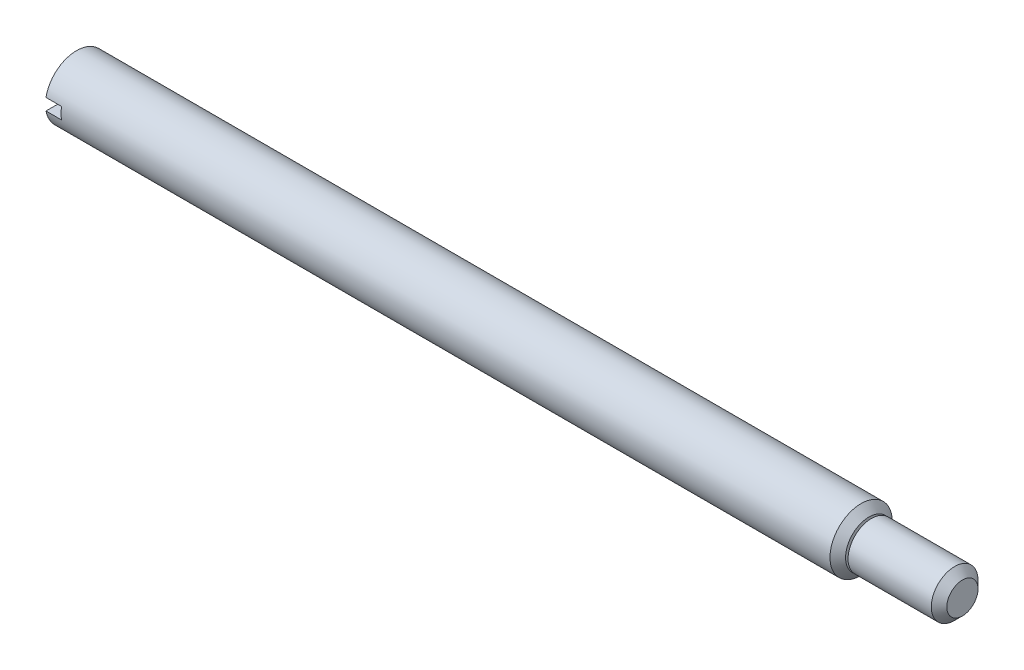
ISO-10303-21;
HEADER;
FILE_DESCRIPTION(('STEP AP214'),'2;1');
FILE_NAME('part.step','',(''),(''),'','','');
FILE_SCHEMA(('AUTOMOTIVE_DESIGN { 1 0 10303 214 1 1 1 1 }'));
ENDSEC;
DATA;
#1=APPLICATION_CONTEXT('core data for automotive mechanical design processes');
#2=APPLICATION_PROTOCOL_DEFINITION('international standard','automotive_design',2000,#1);
#3=PRODUCT_CONTEXT('',#1,'mechanical');
#4=PRODUCT('Part','Part','',(#3));
#5=PRODUCT_RELATED_PRODUCT_CATEGORY('part','',(#4));
#6=PRODUCT_DEFINITION_FORMATION('','',#4);
#7=PRODUCT_DEFINITION_CONTEXT('part definition',#1,'design');
#8=PRODUCT_DEFINITION('design','',#6,#7);
#9=PRODUCT_DEFINITION_SHAPE('','',#8);
#10=(LENGTH_UNIT() NAMED_UNIT(*) SI_UNIT(.MILLI.,.METRE.));
#11=(NAMED_UNIT(*) PLANE_ANGLE_UNIT() SI_UNIT($,.RADIAN.));
#12=(NAMED_UNIT(*) SI_UNIT($,.STERADIAN.) SOLID_ANGLE_UNIT());
#13=UNCERTAINTY_MEASURE_WITH_UNIT(LENGTH_MEASURE(1.E-05),#10,'distance_accuracy_value','');
#14=(GEOMETRIC_REPRESENTATION_CONTEXT(3) GLOBAL_UNCERTAINTY_ASSIGNED_CONTEXT((#13)) GLOBAL_UNIT_ASSIGNED_CONTEXT((#10,
#11,#12)) REPRESENTATION_CONTEXT('',''));
#15=CARTESIAN_POINT('',(0.,0.,0.));
#16=DIRECTION('',(0.,0.,1.));
#17=DIRECTION('',(1.,0.,0.));
#18=AXIS2_PLACEMENT_3D('',#15,#16,#17);
#19=CARTESIAN_POINT('',(-101.7,0.,0.));
#20=DIRECTION('',(1.,0.,0.));
#21=DIRECTION('',(0.,0.,-1.));
#22=AXIS2_PLACEMENT_3D('',#19,#20,#21);
#23=PLANE('',#22);
#24=CARTESIAN_POINT('',(-101.7,0.,0.));
#25=DIRECTION('',(1.,0.,0.));
#26=DIRECTION('',(0.,0.,-1.));
#27=AXIS2_PLACEMENT_3D('',#24,#25,#26);
#28=CIRCLE('',#27,4.);
#29=CARTESIAN_POINT('',(-101.7,-0.75,3.92905841137543));
#30=VERTEX_POINT('',#29);
#31=CARTESIAN_POINT('',(-101.7,-0.75,-3.92905841137543));
#32=VERTEX_POINT('',#31);
#33=EDGE_CURVE('E91',#30,#32,#28,.T.);
#34=ORIENTED_EDGE('',*,*,#33,.F.);
#35=DIRECTION('',(0.,0.,-1.));
#36=VECTOR('',#35,1.);
#37=CARTESIAN_POINT('',(-101.7,-0.75,0.));
#38=LINE('',#37,#36);
#39=EDGE_CURVE('E78',#30,#32,#38,.T.);
#40=ORIENTED_EDGE('',*,*,#39,.T.);
#41=EDGE_LOOP('',(#34,#40));
#42=FACE_BOUND('',#41,.T.);
#43=ADVANCED_FACE('F31',(#42),#23,.F.);
#44=CARTESIAN_POINT('',(12.,2.,0.));
#45=DIRECTION('',(1.,0.,0.));
#46=DIRECTION('',(0.,0.,-1.));
#47=AXIS2_PLACEMENT_3D('',#44,#45,#46);
#48=PLANE('',#47);
#49=CARTESIAN_POINT('',(12.,0.,0.));
#50=DIRECTION('',(-1.,0.,0.));
#51=DIRECTION('',(0.,0.,1.));
#52=AXIS2_PLACEMENT_3D('',#49,#50,#51);
#53=CIRCLE('',#52,2.);
#54=CARTESIAN_POINT('',(12.,0.,2.));
#55=VERTEX_POINT('',#54);
#56=EDGE_CURVE('E106',#55,#55,#53,.T.);
#57=ORIENTED_EDGE('',*,*,#56,.F.);
#58=EDGE_LOOP('',(#57));
#59=FACE_BOUND('',#58,.T.);
#60=ADVANCED_FACE('F125',(#59),#48,.T.);
#61=CARTESIAN_POINT('',(11.0000000000001,0.,0.));
#62=DIRECTION('',(-1.,0.,0.));
#63=DIRECTION('',(0.,0.,1.));
#64=AXIS2_PLACEMENT_3D('',#61,#62,#63);
#65=CONICAL_SURFACE('',#64,3.,0.785398163397474);
#66=ORIENTED_EDGE('',*,*,#56,.T.);
#67=EDGE_LOOP('',(#66));
#68=FACE_BOUND('',#67,.T.);
#69=CARTESIAN_POINT('',(11.0000000000001,0.,0.));
#70=DIRECTION('',(-1.,0.,0.));
#71=DIRECTION('',(0.,0.,1.));
#72=AXIS2_PLACEMENT_3D('',#69,#70,#71);
#73=CIRCLE('',#72,3.);
#74=CARTESIAN_POINT('',(11.0000000000001,0.,3.));
#75=VERTEX_POINT('',#74);
#76=EDGE_CURVE('E103',#75,#75,#73,.T.);
#77=ORIENTED_EDGE('',*,*,#76,.F.);
#78=EDGE_LOOP('',(#77));
#79=FACE_BOUND('',#78,.T.);
#80=ADVANCED_FACE('F130',(#68,#79),#65,.T.);
#81=CARTESIAN_POINT('',(-12.7,0.,0.));
#82=DIRECTION('',(-1.,0.,0.));
#83=DIRECTION('',(0.,0.,1.));
#84=AXIS2_PLACEMENT_3D('',#81,#82,#83);
#85=CYLINDRICAL_SURFACE('',#84,3.);
#86=ORIENTED_EDGE('',*,*,#76,.T.);
#87=EDGE_LOOP('',(#86));
#88=FACE_BOUND('',#87,.T.);
#89=CARTESIAN_POINT('',(0.320140724265646,0.,0.));
#90=DIRECTION('',(-1.,0.,0.));
#91=DIRECTION('',(0.,0.,1.));
#92=AXIS2_PLACEMENT_3D('',#89,#90,#91);
#93=CIRCLE('',#92,3.);
#94=CARTESIAN_POINT('',(0.320140724265646,0.,3.));
#95=VERTEX_POINT('',#94);
#96=EDGE_CURVE('E94',#95,#95,#93,.T.);
#97=ORIENTED_EDGE('',*,*,#96,.F.);
#98=EDGE_LOOP('',(#97));
#99=FACE_BOUND('',#98,.T.);
#100=ADVANCED_FACE('F146',(#88,#99),#85,.T.);
#101=CARTESIAN_POINT('',(0.,0.,0.));
#102=DIRECTION('',(1.,0.,0.));
#103=DIRECTION('',(0.,0.,-1.));
#104=AXIS2_PLACEMENT_3D('',#101,#102,#103);
#105=CONICAL_SURFACE('',#104,2.4455,1.0471975511966);
#106=ORIENTED_EDGE('',*,*,#96,.T.);
#107=EDGE_LOOP('',(#106));
#108=FACE_BOUND('',#107,.T.);
#109=CARTESIAN_POINT('',(0.,0.,0.));
#110=DIRECTION('',(-1.,0.,0.));
#111=DIRECTION('',(0.,0.,1.));
#112=AXIS2_PLACEMENT_3D('',#109,#110,#111);
#113=CIRCLE('',#112,2.4455);
#114=CARTESIAN_POINT('',(0.,0.,2.4455));
#115=VERTEX_POINT('',#114);
#116=EDGE_CURVE('E90',#115,#115,#113,.T.);
#117=ORIENTED_EDGE('',*,*,#116,.F.);
#118=EDGE_LOOP('',(#117));
#119=FACE_BOUND('',#118,.T.);
#120=ADVANCED_FACE('F141',(#108,#119),#105,.T.);
#121=CARTESIAN_POINT('',(-101.7,0.,0.));
#122=DIRECTION('',(1.,0.,0.));
#123=DIRECTION('',(0.,0.,-1.));
#124=AXIS2_PLACEMENT_3D('',#121,#122,#123);
#125=CYLINDRICAL_SURFACE('',#124,4.);
#126=DIRECTION('',(1.,0.,0.));
#127=VECTOR('',#126,1.);
#128=CARTESIAN_POINT('',(-101.7,-0.75,3.92905841137543));
#129=LINE('',#128,#127);
#130=CARTESIAN_POINT('',(-99.7,-0.75,3.92905841137543));
#131=VERTEX_POINT('',#130);
#132=EDGE_CURVE('E54',#30,#131,#129,.T.);
#133=ORIENTED_EDGE('',*,*,#132,.F.);
#134=ORIENTED_EDGE('',*,*,#33,.T.);
#135=DIRECTION('',(1.,0.,0.));
#136=VECTOR('',#135,1.);
#137=CARTESIAN_POINT('',(-101.7,-0.75,-3.92905841137543));
#138=LINE('',#137,#136);
#139=CARTESIAN_POINT('',(-99.7,-0.75,-3.92905841137543));
#140=VERTEX_POINT('',#139);
#141=EDGE_CURVE('E97',#140,#32,#138,.F.);
#142=ORIENTED_EDGE('',*,*,#141,.F.);
#143=CARTESIAN_POINT('',(-99.7,0.,0.));
#144=DIRECTION('',(1.,0.,0.));
#145=DIRECTION('',(0.,0.,-1.));
#146=AXIS2_PLACEMENT_3D('',#143,#144,#145);
#147=CIRCLE('',#146,4.);
#148=CARTESIAN_POINT('',(-99.7,0.75,-3.92905841137543));
#149=VERTEX_POINT('',#148);
#150=EDGE_CURVE('E35',#149,#140,#147,.F.);
#151=ORIENTED_EDGE('',*,*,#150,.F.);
#152=DIRECTION('',(1.,0.,0.));
#153=VECTOR('',#152,1.);
#154=CARTESIAN_POINT('',(-101.7,0.75,-3.92905841137543));
#155=LINE('',#154,#153);
#156=CARTESIAN_POINT('',(-101.7,0.75,-3.92905841137543));
#157=VERTEX_POINT('',#156);
#158=EDGE_CURVE('E73',#157,#149,#155,.T.);
#159=ORIENTED_EDGE('',*,*,#158,.F.);
#160=CARTESIAN_POINT('',(-101.7,0.75,3.92905841137543));
#161=VERTEX_POINT('',#160);
#162=EDGE_CURVE('E85',#157,#161,#28,.T.);
#163=ORIENTED_EDGE('',*,*,#162,.T.);
#164=DIRECTION('',(1.,0.,0.));
#165=VECTOR('',#164,1.);
#166=CARTESIAN_POINT('',(-101.7,0.75,3.92905841137543));
#167=LINE('',#166,#165);
#168=CARTESIAN_POINT('',(-99.7,0.75,3.92905841137543));
#169=VERTEX_POINT('',#168);
#170=EDGE_CURVE('E46',#169,#161,#167,.F.);
#171=ORIENTED_EDGE('',*,*,#170,.F.);
#172=EDGE_CURVE('E11',#131,#169,#147,.F.);
#173=ORIENTED_EDGE('',*,*,#172,.F.);
#174=EDGE_LOOP('',(#133,#134,#142,#151,#159,#163,#171,#173));
#175=FACE_BOUND('',#174,.T.);
#176=CARTESIAN_POINT('',(-0.999999999999973,0.,0.));
#177=DIRECTION('',(1.,0.,0.));
#178=DIRECTION('',(0.,0.,-1.));
#179=AXIS2_PLACEMENT_3D('',#176,#177,#178);
#180=CIRCLE('',#179,4.);
#181=CARTESIAN_POINT('',(-0.999999999999973,0.,-4.));
#182=VERTEX_POINT('',#181);
#183=EDGE_CURVE('E79',#182,#182,#180,.F.);
#184=ORIENTED_EDGE('',*,*,#183,.T.);
#185=EDGE_LOOP('',(#184));
#186=FACE_BOUND('',#185,.T.);
#187=ADVANCED_FACE('F83',(#175,#186),#125,.T.);
#188=ORIENTED_EDGE('',*,*,#162,.F.);
#189=DIRECTION('',(0.,0.,1.));
#190=VECTOR('',#189,1.);
#191=CARTESIAN_POINT('',(-101.7,0.75,0.));
#192=LINE('',#191,#190);
#193=EDGE_CURVE('E70',#157,#161,#192,.T.);
#194=ORIENTED_EDGE('',*,*,#193,.T.);
#195=EDGE_LOOP('',(#188,#194));
#196=FACE_BOUND('',#195,.T.);
#197=ADVANCED_FACE('F89',(#196),#23,.F.);
#198=CARTESIAN_POINT('',(0.,0.,0.));
#199=DIRECTION('',(1.,0.,0.));
#200=DIRECTION('',(0.,0.,-1.));
#201=AXIS2_PLACEMENT_3D('',#198,#199,#200);
#202=PLANE('',#201);
#203=CARTESIAN_POINT('',(0.,0.,0.));
#204=DIRECTION('',(1.,0.,0.));
#205=DIRECTION('',(0.,0.,-1.));
#206=AXIS2_PLACEMENT_3D('',#203,#204,#205);
#207=CIRCLE('',#206,3.00000000000002);
#208=CARTESIAN_POINT('',(0.,0.,-3.00000000000002));
#209=VERTEX_POINT('',#208);
#210=EDGE_CURVE('E109',#209,#209,#207,.T.);
#211=ORIENTED_EDGE('',*,*,#210,.T.);
#212=EDGE_LOOP('',(#211));
#213=FACE_BOUND('',#212,.T.);
#214=ORIENTED_EDGE('',*,*,#116,.T.);
#215=EDGE_LOOP('',(#214));
#216=FACE_BOUND('',#215,.T.);
#217=ADVANCED_FACE('F135',(#213,#216),#202,.T.);
#218=CARTESIAN_POINT('',(0.,0.,0.));
#219=DIRECTION('',(-1.,0.,0.));
#220=DIRECTION('',(0.,0.,1.));
#221=AXIS2_PLACEMENT_3D('',#218,#219,#220);
#222=CONICAL_SURFACE('',#221,3.00000000000002,0.785398163397454);
#223=ORIENTED_EDGE('',*,*,#183,.F.);
#224=EDGE_LOOP('',(#223));
#225=FACE_BOUND('',#224,.T.);
#226=ORIENTED_EDGE('',*,*,#210,.F.);
#227=EDGE_LOOP('',(#226));
#228=FACE_BOUND('',#227,.T.);
#229=ADVANCED_FACE('F33',(#225,#228),#222,.T.);
#230=CARTESIAN_POINT('',(-99.7,-0.75,-4.23957830667394));
#231=DIRECTION('',(0.,-1.,0.));
#232=DIRECTION('',(0.,0.,-1.));
#233=AXIS2_PLACEMENT_3D('',#230,#231,#232);
#234=PLANE('',#233);
#235=ORIENTED_EDGE('',*,*,#141,.T.);
#236=ORIENTED_EDGE('',*,*,#39,.F.);
#237=ORIENTED_EDGE('',*,*,#132,.T.);
#238=DIRECTION('',(0.,0.,1.));
#239=VECTOR('',#238,1.);
#240=CARTESIAN_POINT('',(-99.7,-0.75,-4.23957830667394));
#241=LINE('',#240,#239);
#242=EDGE_CURVE('E87',#140,#131,#241,.T.);
#243=ORIENTED_EDGE('',*,*,#242,.F.);
#244=EDGE_LOOP('',(#235,#236,#237,#243));
#245=FACE_BOUND('',#244,.T.);
#246=ADVANCED_FACE('F120',(#245),#234,.F.);
#247=CARTESIAN_POINT('',(-99.7,0.75,-4.23957830667394));
#248=DIRECTION('',(0.,1.,0.));
#249=DIRECTION('',(0.,0.,1.));
#250=AXIS2_PLACEMENT_3D('',#247,#248,#249);
#251=PLANE('',#250);
#252=ORIENTED_EDGE('',*,*,#170,.T.);
#253=ORIENTED_EDGE('',*,*,#193,.F.);
#254=ORIENTED_EDGE('',*,*,#158,.T.);
#255=DIRECTION('',(0.,0.,-1.));
#256=VECTOR('',#255,1.);
#257=CARTESIAN_POINT('',(-99.7,0.75,-4.23957830667394));
#258=LINE('',#257,#256);
#259=EDGE_CURVE('E119',#169,#149,#258,.T.);
#260=ORIENTED_EDGE('',*,*,#259,.F.);
#261=EDGE_LOOP('',(#252,#253,#254,#260));
#262=FACE_BOUND('',#261,.T.);
#263=ADVANCED_FACE('F72',(#262),#251,.F.);
#264=CARTESIAN_POINT('',(-99.7,0.75,4.23957830667394));
#265=DIRECTION('',(1.,0.,0.));
#266=DIRECTION('',(0.,0.,-1.));
#267=AXIS2_PLACEMENT_3D('',#264,#265,#266);
#268=PLANE('',#267);
#269=ORIENTED_EDGE('',*,*,#172,.T.);
#270=ORIENTED_EDGE('',*,*,#259,.T.);
#271=ORIENTED_EDGE('',*,*,#150,.T.);
#272=ORIENTED_EDGE('',*,*,#242,.T.);
#273=EDGE_LOOP('',(#269,#270,#271,#272));
#274=FACE_BOUND('',#273,.T.);
#275=ADVANCED_FACE('F117',(#274),#268,.F.);
#276=CLOSED_SHELL('',(#43,#60,#80,#100,#120,#187,#197,#217,#229,#246,#263,#275));
#277=MANIFOLD_SOLID_BREP('B2',#276);
#278=ADVANCED_BREP_SHAPE_REPRESENTATION('',(#18,#277),#14);
#279=SHAPE_DEFINITION_REPRESENTATION(#9,#278);
ENDSEC;
END-ISO-10303-21;
